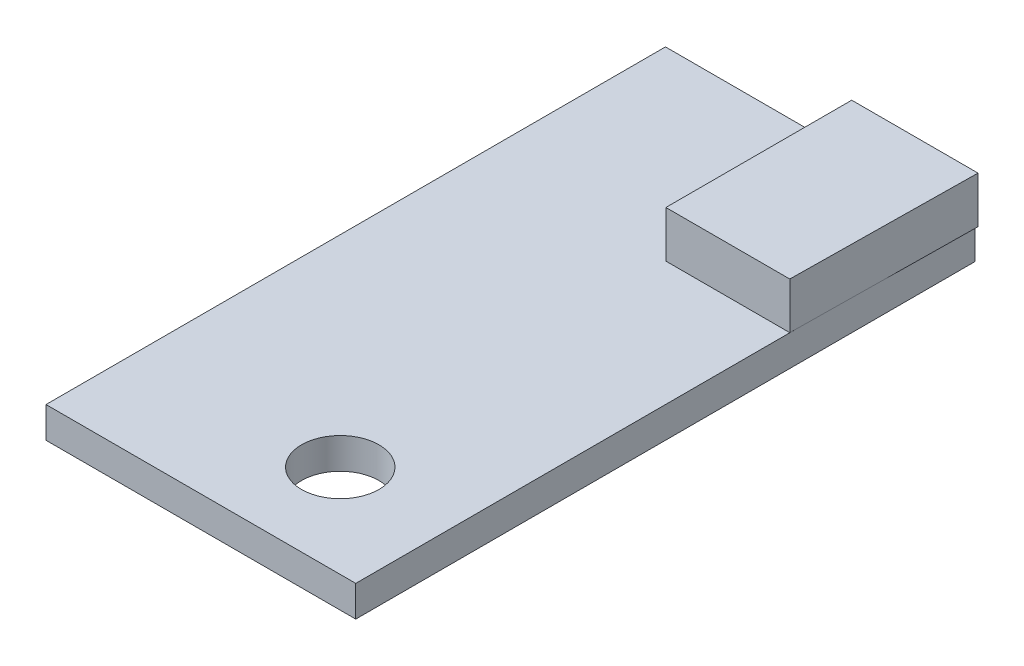
ISO-10303-21;
HEADER;
FILE_DESCRIPTION(('STEP AP214'),'2;1');
FILE_NAME('part.step','',(''),(''),'','','');
FILE_SCHEMA(('AUTOMOTIVE_DESIGN { 1 0 10303 214 1 1 1 1 }'));
ENDSEC;
DATA;
#1=APPLICATION_CONTEXT('core data for automotive mechanical design processes');
#2=APPLICATION_PROTOCOL_DEFINITION('international standard','automotive_design',2000,#1);
#3=PRODUCT_CONTEXT('',#1,'mechanical');
#4=PRODUCT('Part','Part','',(#3));
#5=PRODUCT_RELATED_PRODUCT_CATEGORY('part','',(#4));
#6=PRODUCT_DEFINITION_FORMATION('','',#4);
#7=PRODUCT_DEFINITION_CONTEXT('part definition',#1,'design');
#8=PRODUCT_DEFINITION('design','',#6,#7);
#9=PRODUCT_DEFINITION_SHAPE('','',#8);
#10=(LENGTH_UNIT() NAMED_UNIT(*) SI_UNIT(.MILLI.,.METRE.));
#11=(NAMED_UNIT(*) PLANE_ANGLE_UNIT() SI_UNIT($,.RADIAN.));
#12=(NAMED_UNIT(*) SI_UNIT($,.STERADIAN.) SOLID_ANGLE_UNIT());
#13=UNCERTAINTY_MEASURE_WITH_UNIT(LENGTH_MEASURE(1.E-05),#10,'distance_accuracy_value','');
#14=(GEOMETRIC_REPRESENTATION_CONTEXT(3) GLOBAL_UNCERTAINTY_ASSIGNED_CONTEXT((#13)) GLOBAL_UNIT_ASSIGNED_CONTEXT((#10,
#11,#12)) REPRESENTATION_CONTEXT('',''));
#15=CARTESIAN_POINT('',(0.,0.,0.));
#16=DIRECTION('',(0.,0.,1.));
#17=DIRECTION('',(1.,0.,0.));
#18=AXIS2_PLACEMENT_3D('',#15,#16,#17);
#19=CARTESIAN_POINT('',(0.,10.,0.));
#20=DIRECTION('',(1.,0.,0.));
#21=DIRECTION('',(0.,0.,-1.));
#22=AXIS2_PLACEMENT_3D('',#19,#20,#21);
#23=PLANE('',#22);
#24=DIRECTION('',(0.,0.,1.));
#25=VECTOR('',#24,1.);
#26=CARTESIAN_POINT('',(0.,0.,0.));
#27=LINE('',#26,#25);
#28=CARTESIAN_POINT('',(0.,0.,0.));
#29=VERTEX_POINT('',#28);
#30=CARTESIAN_POINT('',(0.,0.,200.000010960361));
#31=VERTEX_POINT('',#30);
#32=EDGE_CURVE('E131',#29,#31,#27,.T.);
#33=ORIENTED_EDGE('',*,*,#32,.T.);
#34=DIRECTION('',(0.,-1.,0.));
#35=VECTOR('',#34,1.);
#36=CARTESIAN_POINT('',(0.,10.,200.000010960361));
#37=LINE('',#36,#35);
#38=CARTESIAN_POINT('',(0.,10.,200.000010960361));
#39=VERTEX_POINT('',#38);
#40=EDGE_CURVE('E39',#39,#31,#37,.T.);
#41=ORIENTED_EDGE('',*,*,#40,.F.);
#42=DIRECTION('',(0.,0.,1.));
#43=VECTOR('',#42,1.);
#44=CARTESIAN_POINT('',(0.,10.,0.));
#45=LINE('',#44,#43);
#46=CARTESIAN_POINT('',(0.,10.,0.));
#47=VERTEX_POINT('',#46);
#48=EDGE_CURVE('E140',#47,#39,#45,.T.);
#49=ORIENTED_EDGE('',*,*,#48,.F.);
#50=DIRECTION('',(0.,-1.,0.));
#51=VECTOR('',#50,1.);
#52=CARTESIAN_POINT('',(0.,10.,0.));
#53=LINE('',#52,#51);
#54=EDGE_CURVE('E152',#47,#29,#53,.T.);
#55=ORIENTED_EDGE('',*,*,#54,.T.);
#56=EDGE_LOOP('',(#33,#41,#49,#55));
#57=FACE_BOUND('',#56,.T.);
#58=ADVANCED_FACE('F36',(#57),#23,.F.);
#59=CARTESIAN_POINT('',(100.,10.,200.));
#60=DIRECTION('',(-1.0960360841139E-07,0.,-0.999999999999994));
#61=DIRECTION('',(-0.999999999999994,0.,1.0960360841139E-07));
#62=AXIS2_PLACEMENT_3D('',#59,#60,#61);
#63=PLANE('',#62);
#64=DIRECTION('',(0.999999999999994,0.,-1.0960360841139E-07));
#65=VECTOR('',#64,1.);
#66=CARTESIAN_POINT('',(100.,0.,200.));
#67=LINE('',#66,#65);
#68=CARTESIAN_POINT('',(100.,0.,200.));
#69=VERTEX_POINT('',#68);
#70=EDGE_CURVE('E134',#31,#69,#67,.T.);
#71=ORIENTED_EDGE('',*,*,#70,.T.);
#72=DIRECTION('',(0.,-1.,0.));
#73=VECTOR('',#72,1.);
#74=CARTESIAN_POINT('',(100.,10.,200.));
#75=LINE('',#74,#73);
#76=CARTESIAN_POINT('',(100.,10.,200.));
#77=VERTEX_POINT('',#76);
#78=EDGE_CURVE('E162',#77,#69,#75,.T.);
#79=ORIENTED_EDGE('',*,*,#78,.F.);
#80=DIRECTION('',(0.999999999999994,0.,-1.0960360841139E-07));
#81=VECTOR('',#80,1.);
#82=CARTESIAN_POINT('',(100.,10.,200.));
#83=LINE('',#82,#81);
#84=EDGE_CURVE('E143',#39,#77,#83,.T.);
#85=ORIENTED_EDGE('',*,*,#84,.F.);
#86=ORIENTED_EDGE('',*,*,#40,.T.);
#87=EDGE_LOOP('',(#71,#79,#85,#86));
#88=FACE_BOUND('',#87,.T.);
#89=ADVANCED_FACE('F171',(#88),#63,.F.);
#90=CARTESIAN_POINT('',(100.00000548018,10.,0.));
#91=DIRECTION('',(-1.,0.,-2.74009017559029E-08));
#92=DIRECTION('',(-2.74009017559029E-08,0.,1.));
#93=AXIS2_PLACEMENT_3D('',#90,#91,#92);
#94=PLANE('',#93);
#95=DIRECTION('',(2.74009017559029E-08,0.,-1.));
#96=VECTOR('',#95,1.);
#97=CARTESIAN_POINT('',(100.00000548018,0.,0.));
#98=LINE('',#97,#96);
#99=CARTESIAN_POINT('',(100.00000548018,0.,0.));
#100=VERTEX_POINT('',#99);
#101=EDGE_CURVE('E155',#69,#100,#98,.T.);
#102=ORIENTED_EDGE('',*,*,#101,.T.);
#103=DIRECTION('',(0.,-1.,0.));
#104=VECTOR('',#103,1.);
#105=CARTESIAN_POINT('',(100.00000548018,10.,0.));
#106=LINE('',#105,#104);
#107=CARTESIAN_POINT('',(100.00000548018,10.,0.));
#108=VERTEX_POINT('',#107);
#109=EDGE_CURVE('E160',#108,#100,#106,.T.);
#110=ORIENTED_EDGE('',*,*,#109,.F.);
#111=DIRECTION('',(2.74009017559029E-08,0.,-1.));
#112=VECTOR('',#111,1.);
#113=CARTESIAN_POINT('',(100.00000548018,10.,0.));
#114=LINE('',#113,#112);
#115=CARTESIAN_POINT('',(100.000003914445,10.,57.1417315966761));
#116=VERTEX_POINT('',#115);
#117=EDGE_CURVE('E146',#116,#108,#114,.T.);
#118=ORIENTED_EDGE('',*,*,#117,.F.);
#119=EDGE_CURVE('E147',#77,#116,#114,.T.);
#120=ORIENTED_EDGE('',*,*,#119,.F.);
#121=ORIENTED_EDGE('',*,*,#78,.T.);
#122=EDGE_LOOP('',(#102,#110,#118,#120,#121));
#123=FACE_BOUND('',#122,.T.);
#124=ADVANCED_FACE('F179',(#123),#94,.F.);
#125=CARTESIAN_POINT('',(0.,10.,0.));
#126=DIRECTION('',(0.,0.,1.));
#127=DIRECTION('',(1.,0.,0.));
#128=AXIS2_PLACEMENT_3D('',#125,#126,#127);
#129=PLANE('',#128);
#130=DIRECTION('',(-1.,0.,0.));
#131=VECTOR('',#130,1.);
#132=CARTESIAN_POINT('',(0.,0.,0.));
#133=LINE('',#132,#131);
#134=EDGE_CURVE('E144',#100,#29,#133,.T.);
#135=ORIENTED_EDGE('',*,*,#134,.T.);
#136=ORIENTED_EDGE('',*,*,#54,.F.);
#137=DIRECTION('',(-1.,0.,0.));
#138=VECTOR('',#137,1.);
#139=CARTESIAN_POINT('',(0.,10.,0.));
#140=LINE('',#139,#138);
#141=CARTESIAN_POINT('',(59.9654186672478,10.,0.));
#142=VERTEX_POINT('',#141);
#143=EDGE_CURVE('E149',#142,#47,#140,.T.);
#144=ORIENTED_EDGE('',*,*,#143,.F.);
#145=EDGE_CURVE('E150',#108,#142,#140,.T.);
#146=ORIENTED_EDGE('',*,*,#145,.F.);
#147=ORIENTED_EDGE('',*,*,#109,.T.);
#148=EDGE_LOOP('',(#135,#136,#144,#146,#147));
#149=FACE_BOUND('',#148,.T.);
#150=ADVANCED_FACE('F182',(#149),#129,.F.);
#151=CARTESIAN_POINT('',(0.,10.,0.));
#152=DIRECTION('',(0.,1.,0.));
#153=DIRECTION('',(0.,0.,1.));
#154=AXIS2_PLACEMENT_3D('',#151,#152,#153);
#155=PLANE('',#154);
#156=CARTESIAN_POINT('',(65.,10.,170.));
#157=DIRECTION('',(0.,1.,0.));
#158=DIRECTION('',(0.,0.,1.));
#159=AXIS2_PLACEMENT_3D('',#156,#157,#158);
#160=CIRCLE('',#159,12.5);
#161=CARTESIAN_POINT('',(65.,10.,182.5));
#162=VERTEX_POINT('',#161);
#163=EDGE_CURVE('E295',#162,#162,#160,.T.);
#164=ORIENTED_EDGE('',*,*,#163,.F.);
#165=EDGE_LOOP('',(#164));
#166=FACE_BOUND('',#165,.T.);
#167=DIRECTION('',(0.0128202931549665,0.,-0.99991781666466));
#168=VECTOR('',#167,1.);
#169=CARTESIAN_POINT('',(100.734699478609,10.,-0.160794605442934));
#170=LINE('',#169,#168);
#171=CARTESIAN_POINT('',(99.9654186672478,10.,59.8392053945571));
#172=VERTEX_POINT('',#171);
#173=EDGE_CURVE('E52',#172,#116,#170,.T.);
#174=ORIENTED_EDGE('',*,*,#173,.F.);
#175=DIRECTION('',(1.,0.,0.));
#176=VECTOR('',#175,1.);
#177=CARTESIAN_POINT('',(59.9654186672478,10.,59.8392053945571));
#178=LINE('',#177,#176);
#179=CARTESIAN_POINT('',(59.9654186672478,10.,59.8392053945571));
#180=VERTEX_POINT('',#179);
#181=EDGE_CURVE('E303',#180,#172,#178,.T.);
#182=ORIENTED_EDGE('',*,*,#181,.F.);
#183=DIRECTION('',(0.,0.,1.));
#184=VECTOR('',#183,1.);
#185=CARTESIAN_POINT('',(59.9654186672478,10.,-0.160794605442934));
#186=LINE('',#185,#184);
#187=EDGE_CURVE('E11',#142,#180,#186,.T.);
#188=ORIENTED_EDGE('',*,*,#187,.F.);
#189=ORIENTED_EDGE('',*,*,#143,.T.);
#190=ORIENTED_EDGE('',*,*,#48,.T.);
#191=ORIENTED_EDGE('',*,*,#84,.T.);
#192=ORIENTED_EDGE('',*,*,#119,.T.);
#193=EDGE_LOOP('',(#174,#182,#188,#189,#190,#191,#192));
#194=FACE_BOUND('',#193,.T.);
#195=ADVANCED_FACE('F188',(#166,#194),#155,.T.);
#196=CARTESIAN_POINT('',(0.,0.,0.));
#197=DIRECTION('',(0.,1.,0.));
#198=DIRECTION('',(0.,0.,1.));
#199=AXIS2_PLACEMENT_3D('',#196,#197,#198);
#200=PLANE('',#199);
#201=CARTESIAN_POINT('',(65.,0.,170.));
#202=DIRECTION('',(0.,1.,0.));
#203=DIRECTION('',(0.,0.,1.));
#204=AXIS2_PLACEMENT_3D('',#201,#202,#203);
#205=CIRCLE('',#204,12.5);
#206=CARTESIAN_POINT('',(65.,0.,182.5));
#207=VERTEX_POINT('',#206);
#208=EDGE_CURVE('E293',#207,#207,#205,.T.);
#209=ORIENTED_EDGE('',*,*,#208,.T.);
#210=EDGE_LOOP('',(#209));
#211=FACE_BOUND('',#210,.T.);
#212=ORIENTED_EDGE('',*,*,#32,.F.);
#213=ORIENTED_EDGE('',*,*,#134,.F.);
#214=ORIENTED_EDGE('',*,*,#101,.F.);
#215=ORIENTED_EDGE('',*,*,#70,.F.);
#216=EDGE_LOOP('',(#212,#213,#214,#215));
#217=FACE_BOUND('',#216,.T.);
#218=ADVANCED_FACE('F178',(#211,#217),#200,.F.);
#219=CARTESIAN_POINT('',(0.,10.,0.));
#220=DIRECTION('',(0.,1.,0.));
#221=DIRECTION('',(0.,0.,1.));
#222=AXIS2_PLACEMENT_3D('',#219,#220,#221);
#223=PLANE('',#222);
#224=CARTESIAN_POINT('',(100.734699478609,10.,-0.160794605442934));
#225=VERTEX_POINT('',#224);
#226=EDGE_CURVE('E187',#116,#225,#170,.T.);
#227=ORIENTED_EDGE('',*,*,#226,.F.);
#228=ORIENTED_EDGE('',*,*,#117,.T.);
#229=ORIENTED_EDGE('',*,*,#145,.T.);
#230=CARTESIAN_POINT('',(59.9654186672478,10.,-0.160794605442934));
#231=VERTEX_POINT('',#230);
#232=EDGE_CURVE('E45',#231,#142,#186,.T.);
#233=ORIENTED_EDGE('',*,*,#232,.F.);
#234=DIRECTION('',(-1.,0.,0.));
#235=VECTOR('',#234,1.);
#236=CARTESIAN_POINT('',(100.734699478609,10.,-0.160794605442934));
#237=LINE('',#236,#235);
#238=EDGE_CURVE('E130',#225,#231,#237,.T.);
#239=ORIENTED_EDGE('',*,*,#238,.F.);
#240=EDGE_LOOP('',(#227,#228,#229,#233,#239));
#241=FACE_BOUND('',#240,.T.);
#242=ADVANCED_FACE('F186',(#241),#223,.F.);
#243=CARTESIAN_POINT('',(100.734699478609,25.,-0.160794605442934));
#244=DIRECTION('',(0.,0.,1.));
#245=DIRECTION('',(1.,0.,0.));
#246=AXIS2_PLACEMENT_3D('',#243,#244,#245);
#247=PLANE('',#246);
#248=ORIENTED_EDGE('',*,*,#238,.T.);
#249=DIRECTION('',(0.,-1.,0.));
#250=VECTOR('',#249,1.);
#251=CARTESIAN_POINT('',(59.9654186672478,25.,-0.160794605442934));
#252=LINE('',#251,#250);
#253=CARTESIAN_POINT('',(59.9654186672478,25.,-0.160794605442934));
#254=VERTEX_POINT('',#253);
#255=EDGE_CURVE('E111',#254,#231,#252,.T.);
#256=ORIENTED_EDGE('',*,*,#255,.F.);
#257=DIRECTION('',(-1.,0.,0.));
#258=VECTOR('',#257,1.);
#259=CARTESIAN_POINT('',(100.734699478609,25.,-0.160794605442934));
#260=LINE('',#259,#258);
#261=CARTESIAN_POINT('',(100.734699478609,25.,-0.160794605442934));
#262=VERTEX_POINT('',#261);
#263=EDGE_CURVE('E118',#262,#254,#260,.T.);
#264=ORIENTED_EDGE('',*,*,#263,.F.);
#265=DIRECTION('',(0.,-1.,0.));
#266=VECTOR('',#265,1.);
#267=CARTESIAN_POINT('',(100.734699478609,25.,-0.160794605442934));
#268=LINE('',#267,#266);
#269=EDGE_CURVE('E301',#262,#225,#268,.T.);
#270=ORIENTED_EDGE('',*,*,#269,.T.);
#271=EDGE_LOOP('',(#248,#256,#264,#270));
#272=FACE_BOUND('',#271,.T.);
#273=ADVANCED_FACE('F128',(#272),#247,.F.);
#274=CARTESIAN_POINT('',(59.9654186672478,25.,-0.160794605442934));
#275=DIRECTION('',(1.,0.,0.));
#276=DIRECTION('',(0.,0.,-1.));
#277=AXIS2_PLACEMENT_3D('',#274,#275,#276);
#278=PLANE('',#277);
#279=ORIENTED_EDGE('',*,*,#232,.T.);
#280=ORIENTED_EDGE('',*,*,#187,.T.);
#281=DIRECTION('',(0.,-1.,0.));
#282=VECTOR('',#281,1.);
#283=CARTESIAN_POINT('',(59.9654186672478,25.,59.8392053945571));
#284=LINE('',#283,#282);
#285=CARTESIAN_POINT('',(59.9654186672478,25.,59.8392053945571));
#286=VERTEX_POINT('',#285);
#287=EDGE_CURVE('E114',#286,#180,#284,.T.);
#288=ORIENTED_EDGE('',*,*,#287,.F.);
#289=DIRECTION('',(0.,0.,1.));
#290=VECTOR('',#289,1.);
#291=CARTESIAN_POINT('',(59.9654186672478,25.,-0.160794605442934));
#292=LINE('',#291,#290);
#293=EDGE_CURVE('E106',#254,#286,#292,.T.);
#294=ORIENTED_EDGE('',*,*,#293,.F.);
#295=ORIENTED_EDGE('',*,*,#255,.T.);
#296=EDGE_LOOP('',(#279,#280,#288,#294,#295));
#297=FACE_BOUND('',#296,.T.);
#298=ADVANCED_FACE('F109',(#297),#278,.F.);
#299=CARTESIAN_POINT('',(59.9654186672478,25.,59.8392053945571));
#300=DIRECTION('',(0.,0.,-1.));
#301=DIRECTION('',(-1.,0.,0.));
#302=AXIS2_PLACEMENT_3D('',#299,#300,#301);
#303=PLANE('',#302);
#304=ORIENTED_EDGE('',*,*,#181,.T.);
#305=DIRECTION('',(0.,-1.,0.));
#306=VECTOR('',#305,1.);
#307=CARTESIAN_POINT('',(99.9654186672478,25.,59.8392053945571));
#308=LINE('',#307,#306);
#309=CARTESIAN_POINT('',(99.9654186672478,25.,59.8392053945571));
#310=VERTEX_POINT('',#309);
#311=EDGE_CURVE('E136',#310,#172,#308,.T.);
#312=ORIENTED_EDGE('',*,*,#311,.F.);
#313=DIRECTION('',(1.,0.,0.));
#314=VECTOR('',#313,1.);
#315=CARTESIAN_POINT('',(59.9654186672478,25.,59.8392053945571));
#316=LINE('',#315,#314);
#317=EDGE_CURVE('E117',#286,#310,#316,.T.);
#318=ORIENTED_EDGE('',*,*,#317,.F.);
#319=ORIENTED_EDGE('',*,*,#287,.T.);
#320=EDGE_LOOP('',(#304,#312,#318,#319));
#321=FACE_BOUND('',#320,.T.);
#322=ADVANCED_FACE('F241',(#321),#303,.F.);
#323=CARTESIAN_POINT('',(100.734699478609,25.,-0.160794605442934));
#324=DIRECTION('',(-0.99991781666466,0.,-0.0128202931549665));
#325=DIRECTION('',(-0.0128202931549665,0.,0.99991781666466));
#326=AXIS2_PLACEMENT_3D('',#323,#324,#325);
#327=PLANE('',#326);
#328=ORIENTED_EDGE('',*,*,#173,.T.);
#329=ORIENTED_EDGE('',*,*,#226,.T.);
#330=ORIENTED_EDGE('',*,*,#269,.F.);
#331=DIRECTION('',(0.0128202931549665,0.,-0.99991781666466));
#332=VECTOR('',#331,1.);
#333=CARTESIAN_POINT('',(100.734699478609,25.,-0.160794605442934));
#334=LINE('',#333,#332);
#335=EDGE_CURVE('E123',#310,#262,#334,.T.);
#336=ORIENTED_EDGE('',*,*,#335,.F.);
#337=ORIENTED_EDGE('',*,*,#311,.T.);
#338=EDGE_LOOP('',(#328,#329,#330,#336,#337));
#339=FACE_BOUND('',#338,.T.);
#340=ADVANCED_FACE('F250',(#339),#327,.F.);
#341=CARTESIAN_POINT('',(0.,25.,0.));
#342=DIRECTION('',(0.,1.,0.));
#343=DIRECTION('',(0.,0.,1.));
#344=AXIS2_PLACEMENT_3D('',#341,#342,#343);
#345=PLANE('',#344);
#346=ORIENTED_EDGE('',*,*,#263,.T.);
#347=ORIENTED_EDGE('',*,*,#293,.T.);
#348=ORIENTED_EDGE('',*,*,#317,.T.);
#349=ORIENTED_EDGE('',*,*,#335,.T.);
#350=EDGE_LOOP('',(#346,#347,#348,#349));
#351=FACE_BOUND('',#350,.T.);
#352=ADVANCED_FACE('F121',(#351),#345,.T.);
#353=CARTESIAN_POINT('',(65.,10.,170.));
#354=DIRECTION('',(0.,1.,0.));
#355=DIRECTION('',(0.,0.,1.));
#356=AXIS2_PLACEMENT_3D('',#353,#354,#355);
#357=CYLINDRICAL_SURFACE('',#356,12.5);
#358=ORIENTED_EDGE('',*,*,#208,.F.);
#359=EDGE_LOOP('',(#358));
#360=FACE_BOUND('',#359,.T.);
#361=ORIENTED_EDGE('',*,*,#163,.T.);
#362=EDGE_LOOP('',(#361));
#363=FACE_BOUND('',#362,.T.);
#364=ADVANCED_FACE('F268',(#360,#363),#357,.F.);
#365=CLOSED_SHELL('',(#58,#89,#124,#150,#195,#218,#242,#273,#298,#322,#340,#352,#364));
#366=MANIFOLD_SOLID_BREP('B2',#365);
#367=ADVANCED_BREP_SHAPE_REPRESENTATION('',(#18,#366),#14);
#368=SHAPE_DEFINITION_REPRESENTATION(#9,#367);
ENDSEC;
END-ISO-10303-21;
